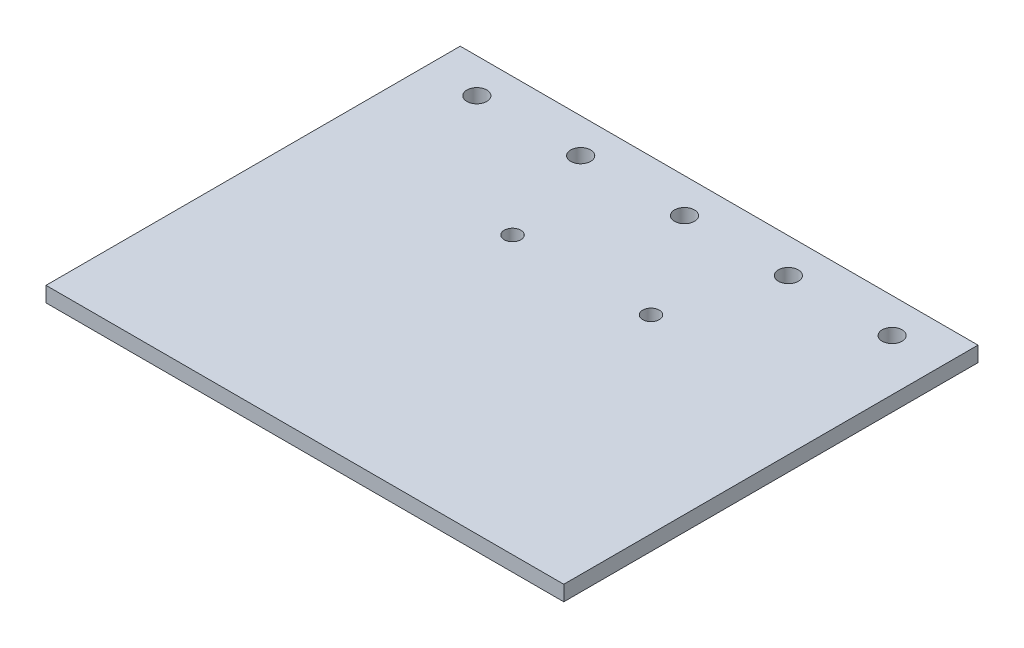
ISO-10303-21;
HEADER;
FILE_DESCRIPTION(('STEP AP214'),'2;1');
FILE_NAME('part.step','',(''),(''),'','','');
FILE_SCHEMA(('AUTOMOTIVE_DESIGN { 1 0 10303 214 1 1 1 1 }'));
ENDSEC;
DATA;
#1=APPLICATION_CONTEXT('core data for automotive mechanical design processes');
#2=APPLICATION_PROTOCOL_DEFINITION('international standard','automotive_design',2000,#1);
#3=PRODUCT_CONTEXT('',#1,'mechanical');
#4=PRODUCT('Part','Part','',(#3));
#5=PRODUCT_RELATED_PRODUCT_CATEGORY('part','',(#4));
#6=PRODUCT_DEFINITION_FORMATION('','',#4);
#7=PRODUCT_DEFINITION_CONTEXT('part definition',#1,'design');
#8=PRODUCT_DEFINITION('design','',#6,#7);
#9=PRODUCT_DEFINITION_SHAPE('','',#8);
#10=(LENGTH_UNIT() NAMED_UNIT(*) SI_UNIT(.MILLI.,.METRE.));
#11=(NAMED_UNIT(*) PLANE_ANGLE_UNIT() SI_UNIT($,.RADIAN.));
#12=(NAMED_UNIT(*) SI_UNIT($,.STERADIAN.) SOLID_ANGLE_UNIT());
#13=UNCERTAINTY_MEASURE_WITH_UNIT(LENGTH_MEASURE(1.E-05),#10,'distance_accuracy_value','');
#14=(GEOMETRIC_REPRESENTATION_CONTEXT(3) GLOBAL_UNCERTAINTY_ASSIGNED_CONTEXT((#13)) GLOBAL_UNIT_ASSIGNED_CONTEXT((#10,
#11,#12)) REPRESENTATION_CONTEXT('',''));
#15=CARTESIAN_POINT('',(0.,0.,0.));
#16=DIRECTION('',(0.,0.,1.));
#17=DIRECTION('',(1.,0.,0.));
#18=AXIS2_PLACEMENT_3D('',#15,#16,#17);
#19=CARTESIAN_POINT('',(47.5,2.794,-38.));
#20=DIRECTION('',(-1.,0.,0.));
#21=DIRECTION('',(0.,0.,1.));
#22=AXIS2_PLACEMENT_3D('',#19,#20,#21);
#23=PLANE('',#22);
#24=DIRECTION('',(0.,0.,-1.));
#25=VECTOR('',#24,1.);
#26=CARTESIAN_POINT('',(47.5,0.,-38.));
#27=LINE('',#26,#25);
#28=CARTESIAN_POINT('',(47.5,0.,38.));
#29=VERTEX_POINT('',#28);
#30=CARTESIAN_POINT('',(47.5,0.,-38.));
#31=VERTEX_POINT('',#30);
#32=EDGE_CURVE('E107',#29,#31,#27,.T.);
#33=ORIENTED_EDGE('',*,*,#32,.T.);
#34=DIRECTION('',(0.,-1.,0.));
#35=VECTOR('',#34,1.);
#36=CARTESIAN_POINT('',(47.5,2.794,-38.));
#37=LINE('',#36,#35);
#38=CARTESIAN_POINT('',(47.5,2.794,-38.));
#39=VERTEX_POINT('',#38);
#40=EDGE_CURVE('E11',#39,#31,#37,.T.);
#41=ORIENTED_EDGE('',*,*,#40,.F.);
#42=DIRECTION('',(0.,0.,-1.));
#43=VECTOR('',#42,1.);
#44=CARTESIAN_POINT('',(47.5,2.794,-38.));
#45=LINE('',#44,#43);
#46=CARTESIAN_POINT('',(47.5,2.794,38.));
#47=VERTEX_POINT('',#46);
#48=EDGE_CURVE('E91',#47,#39,#45,.T.);
#49=ORIENTED_EDGE('',*,*,#48,.F.);
#50=DIRECTION('',(0.,-1.,0.));
#51=VECTOR('',#50,1.);
#52=CARTESIAN_POINT('',(47.5,2.794,38.));
#53=LINE('',#52,#51);
#54=EDGE_CURVE('E103',#47,#29,#53,.T.);
#55=ORIENTED_EDGE('',*,*,#54,.T.);
#56=EDGE_LOOP('',(#33,#41,#49,#55));
#57=FACE_BOUND('',#56,.T.);
#58=ADVANCED_FACE('F39',(#57),#23,.F.);
#59=CARTESIAN_POINT('',(-47.5,2.794,-38.));
#60=DIRECTION('',(0.,0.,1.));
#61=DIRECTION('',(1.,0.,0.));
#62=AXIS2_PLACEMENT_3D('',#59,#60,#61);
#63=PLANE('',#62);
#64=DIRECTION('',(-1.,0.,0.));
#65=VECTOR('',#64,1.);
#66=CARTESIAN_POINT('',(-47.5,0.,-38.));
#67=LINE('',#66,#65);
#68=CARTESIAN_POINT('',(-47.5,0.,-38.));
#69=VERTEX_POINT('',#68);
#70=EDGE_CURVE('E96',#31,#69,#67,.T.);
#71=ORIENTED_EDGE('',*,*,#70,.T.);
#72=DIRECTION('',(0.,-1.,0.));
#73=VECTOR('',#72,1.);
#74=CARTESIAN_POINT('',(-47.5,2.794,-38.));
#75=LINE('',#74,#73);
#76=CARTESIAN_POINT('',(-47.5,2.794,-38.));
#77=VERTEX_POINT('',#76);
#78=EDGE_CURVE('E48',#77,#69,#75,.T.);
#79=ORIENTED_EDGE('',*,*,#78,.F.);
#80=DIRECTION('',(-1.,0.,0.));
#81=VECTOR('',#80,1.);
#82=CARTESIAN_POINT('',(-47.5,2.794,-38.));
#83=LINE('',#82,#81);
#84=EDGE_CURVE('E86',#39,#77,#83,.T.);
#85=ORIENTED_EDGE('',*,*,#84,.F.);
#86=ORIENTED_EDGE('',*,*,#40,.T.);
#87=EDGE_LOOP('',(#71,#79,#85,#86));
#88=FACE_BOUND('',#87,.T.);
#89=ADVANCED_FACE('F95',(#88),#63,.F.);
#90=CARTESIAN_POINT('',(-47.5,2.794,-38.));
#91=DIRECTION('',(1.,0.,0.));
#92=DIRECTION('',(0.,0.,-1.));
#93=AXIS2_PLACEMENT_3D('',#90,#91,#92);
#94=PLANE('',#93);
#95=DIRECTION('',(0.,0.,1.));
#96=VECTOR('',#95,1.);
#97=CARTESIAN_POINT('',(-47.5,0.,-38.));
#98=LINE('',#97,#96);
#99=CARTESIAN_POINT('',(-47.5,0.,38.));
#100=VERTEX_POINT('',#99);
#101=EDGE_CURVE('E73',#69,#100,#98,.T.);
#102=ORIENTED_EDGE('',*,*,#101,.T.);
#103=DIRECTION('',(0.,-1.,0.));
#104=VECTOR('',#103,1.);
#105=CARTESIAN_POINT('',(-47.5,2.794,38.));
#106=LINE('',#105,#104);
#107=CARTESIAN_POINT('',(-47.5,2.794,38.));
#108=VERTEX_POINT('',#107);
#109=EDGE_CURVE('E98',#108,#100,#106,.T.);
#110=ORIENTED_EDGE('',*,*,#109,.F.);
#111=DIRECTION('',(0.,0.,1.));
#112=VECTOR('',#111,1.);
#113=CARTESIAN_POINT('',(-47.5,2.794,-38.));
#114=LINE('',#113,#112);
#115=EDGE_CURVE('E89',#77,#108,#114,.T.);
#116=ORIENTED_EDGE('',*,*,#115,.F.);
#117=ORIENTED_EDGE('',*,*,#78,.T.);
#118=EDGE_LOOP('',(#102,#110,#116,#117));
#119=FACE_BOUND('',#118,.T.);
#120=ADVANCED_FACE('F99',(#119),#94,.F.);
#121=CARTESIAN_POINT('',(-47.5,2.794,38.));
#122=DIRECTION('',(0.,0.,-1.));
#123=DIRECTION('',(-1.,0.,0.));
#124=AXIS2_PLACEMENT_3D('',#121,#122,#123);
#125=PLANE('',#124);
#126=DIRECTION('',(1.,0.,0.));
#127=VECTOR('',#126,1.);
#128=CARTESIAN_POINT('',(-47.5,0.,38.));
#129=LINE('',#128,#127);
#130=EDGE_CURVE('E79',#100,#29,#129,.T.);
#131=ORIENTED_EDGE('',*,*,#130,.T.);
#132=ORIENTED_EDGE('',*,*,#54,.F.);
#133=DIRECTION('',(1.,0.,0.));
#134=VECTOR('',#133,1.);
#135=CARTESIAN_POINT('',(-47.5,2.794,38.));
#136=LINE('',#135,#134);
#137=EDGE_CURVE('E56',#108,#47,#136,.T.);
#138=ORIENTED_EDGE('',*,*,#137,.F.);
#139=ORIENTED_EDGE('',*,*,#109,.T.);
#140=EDGE_LOOP('',(#131,#132,#138,#139));
#141=FACE_BOUND('',#140,.T.);
#142=ADVANCED_FACE('F121',(#141),#125,.F.);
#143=CARTESIAN_POINT('',(0.,2.794,0.));
#144=DIRECTION('',(0.,1.,0.));
#145=DIRECTION('',(0.,0.,1.));
#146=AXIS2_PLACEMENT_3D('',#143,#144,#145);
#147=PLANE('',#146);
#148=CARTESIAN_POINT('',(-12.7,2.794,-12.8));
#149=DIRECTION('',(0.,1.,0.));
#150=DIRECTION('',(0.,0.,1.));
#151=AXIS2_PLACEMENT_3D('',#148,#149,#150);
#152=CIRCLE('',#151,1.524);
#153=CARTESIAN_POINT('',(-12.7,2.794,-11.276));
#154=VERTEX_POINT('',#153);
#155=EDGE_CURVE('E176',#154,#154,#152,.T.);
#156=ORIENTED_EDGE('',*,*,#155,.F.);
#157=EDGE_LOOP('',(#156));
#158=FACE_BOUND('',#157,.T.);
#159=CARTESIAN_POINT('',(12.7,2.794,-12.8));
#160=DIRECTION('',(0.,1.,0.));
#161=DIRECTION('',(0.,0.,1.));
#162=AXIS2_PLACEMENT_3D('',#159,#160,#161);
#163=CIRCLE('',#162,1.524);
#164=CARTESIAN_POINT('',(12.7,2.794,-11.276));
#165=VERTEX_POINT('',#164);
#166=EDGE_CURVE('E168',#165,#165,#163,.T.);
#167=ORIENTED_EDGE('',*,*,#166,.F.);
#168=EDGE_LOOP('',(#167));
#169=FACE_BOUND('',#168,.T.);
#170=CARTESIAN_POINT('',(-38.1,2.794,-31.65));
#171=DIRECTION('',(0.,1.,0.));
#172=DIRECTION('',(0.,0.,1.));
#173=AXIS2_PLACEMENT_3D('',#170,#171,#172);
#174=CIRCLE('',#173,1.8288);
#175=CARTESIAN_POINT('',(-38.1,2.794,-29.8212));
#176=VERTEX_POINT('',#175);
#177=EDGE_CURVE('E161',#176,#176,#174,.T.);
#178=ORIENTED_EDGE('',*,*,#177,.F.);
#179=EDGE_LOOP('',(#178));
#180=FACE_BOUND('',#179,.T.);
#181=CARTESIAN_POINT('',(-19.05,2.794,-31.65));
#182=DIRECTION('',(0.,1.,0.));
#183=DIRECTION('',(0.,0.,1.));
#184=AXIS2_PLACEMENT_3D('',#181,#182,#183);
#185=CIRCLE('',#184,1.8288);
#186=CARTESIAN_POINT('',(-19.05,2.794,-29.8212));
#187=VERTEX_POINT('',#186);
#188=EDGE_CURVE('E153',#187,#187,#185,.T.);
#189=ORIENTED_EDGE('',*,*,#188,.F.);
#190=EDGE_LOOP('',(#189));
#191=FACE_BOUND('',#190,.T.);
#192=CARTESIAN_POINT('',(0.,2.794,-31.65));
#193=DIRECTION('',(0.,1.,0.));
#194=DIRECTION('',(0.,0.,1.));
#195=AXIS2_PLACEMENT_3D('',#192,#193,#194);
#196=CIRCLE('',#195,1.8288);
#197=CARTESIAN_POINT('',(0.,2.794,-29.8212));
#198=VERTEX_POINT('',#197);
#199=EDGE_CURVE('E145',#198,#198,#196,.T.);
#200=ORIENTED_EDGE('',*,*,#199,.F.);
#201=EDGE_LOOP('',(#200));
#202=FACE_BOUND('',#201,.T.);
#203=CARTESIAN_POINT('',(19.05,2.794,-31.65));
#204=DIRECTION('',(0.,1.,0.));
#205=DIRECTION('',(0.,0.,1.));
#206=AXIS2_PLACEMENT_3D('',#203,#204,#205);
#207=CIRCLE('',#206,1.8288);
#208=CARTESIAN_POINT('',(19.05,2.794,-29.8212));
#209=VERTEX_POINT('',#208);
#210=EDGE_CURVE('E137',#209,#209,#207,.T.);
#211=ORIENTED_EDGE('',*,*,#210,.F.);
#212=EDGE_LOOP('',(#211));
#213=FACE_BOUND('',#212,.T.);
#214=CARTESIAN_POINT('',(38.1,2.794,-31.65));
#215=DIRECTION('',(0.,1.,0.));
#216=DIRECTION('',(0.,0.,1.));
#217=AXIS2_PLACEMENT_3D('',#214,#215,#216);
#218=CIRCLE('',#217,1.8288);
#219=CARTESIAN_POINT('',(38.1,2.794,-29.8212));
#220=VERTEX_POINT('',#219);
#221=EDGE_CURVE('E128',#220,#220,#218,.T.);
#222=ORIENTED_EDGE('',*,*,#221,.F.);
#223=EDGE_LOOP('',(#222));
#224=FACE_BOUND('',#223,.T.);
#225=ORIENTED_EDGE('',*,*,#48,.T.);
#226=ORIENTED_EDGE('',*,*,#84,.T.);
#227=ORIENTED_EDGE('',*,*,#115,.T.);
#228=ORIENTED_EDGE('',*,*,#137,.T.);
#229=EDGE_LOOP('',(#225,#226,#227,#228));
#230=FACE_BOUND('',#229,.T.);
#231=ADVANCED_FACE('F87',(#158,#169,#180,#191,#202,#213,#224,#230),#147,.T.);
#232=CARTESIAN_POINT('',(0.,0.,0.));
#233=DIRECTION('',(0.,1.,0.));
#234=DIRECTION('',(0.,0.,1.));
#235=AXIS2_PLACEMENT_3D('',#232,#233,#234);
#236=PLANE('',#235);
#237=CARTESIAN_POINT('',(-12.7,0.,-12.8));
#238=DIRECTION('',(0.,1.,0.));
#239=DIRECTION('',(0.,0.,1.));
#240=AXIS2_PLACEMENT_3D('',#237,#238,#239);
#241=CIRCLE('',#240,1.524);
#242=CARTESIAN_POINT('',(-12.7,0.,-11.276));
#243=VERTEX_POINT('',#242);
#244=EDGE_CURVE('E133',#243,#243,#241,.T.);
#245=ORIENTED_EDGE('',*,*,#244,.T.);
#246=EDGE_LOOP('',(#245));
#247=FACE_BOUND('',#246,.T.);
#248=CARTESIAN_POINT('',(12.7,0.,-12.8));
#249=DIRECTION('',(0.,1.,0.));
#250=DIRECTION('',(0.,0.,1.));
#251=AXIS2_PLACEMENT_3D('',#248,#249,#250);
#252=CIRCLE('',#251,1.524);
#253=CARTESIAN_POINT('',(12.7,0.,-11.276));
#254=VERTEX_POINT('',#253);
#255=EDGE_CURVE('E172',#254,#254,#252,.T.);
#256=ORIENTED_EDGE('',*,*,#255,.T.);
#257=EDGE_LOOP('',(#256));
#258=FACE_BOUND('',#257,.T.);
#259=CARTESIAN_POINT('',(-38.1,0.,-31.65));
#260=DIRECTION('',(0.,1.,0.));
#261=DIRECTION('',(0.,0.,1.));
#262=AXIS2_PLACEMENT_3D('',#259,#260,#261);
#263=CIRCLE('',#262,1.8288);
#264=CARTESIAN_POINT('',(-38.1,0.,-29.8212));
#265=VERTEX_POINT('',#264);
#266=EDGE_CURVE('E111',#265,#265,#263,.T.);
#267=ORIENTED_EDGE('',*,*,#266,.T.);
#268=EDGE_LOOP('',(#267));
#269=FACE_BOUND('',#268,.T.);
#270=CARTESIAN_POINT('',(-19.05,0.,-31.65));
#271=DIRECTION('',(0.,1.,0.));
#272=DIRECTION('',(0.,0.,1.));
#273=AXIS2_PLACEMENT_3D('',#270,#271,#272);
#274=CIRCLE('',#273,1.8288);
#275=CARTESIAN_POINT('',(-19.05,0.,-29.8212));
#276=VERTEX_POINT('',#275);
#277=EDGE_CURVE('E157',#276,#276,#274,.T.);
#278=ORIENTED_EDGE('',*,*,#277,.T.);
#279=EDGE_LOOP('',(#278));
#280=FACE_BOUND('',#279,.T.);
#281=CARTESIAN_POINT('',(0.,0.,-31.65));
#282=DIRECTION('',(0.,1.,0.));
#283=DIRECTION('',(0.,0.,1.));
#284=AXIS2_PLACEMENT_3D('',#281,#282,#283);
#285=CIRCLE('',#284,1.8288);
#286=CARTESIAN_POINT('',(0.,0.,-29.8212));
#287=VERTEX_POINT('',#286);
#288=EDGE_CURVE('E149',#287,#287,#285,.T.);
#289=ORIENTED_EDGE('',*,*,#288,.T.);
#290=EDGE_LOOP('',(#289));
#291=FACE_BOUND('',#290,.T.);
#292=CARTESIAN_POINT('',(19.05,0.,-31.65));
#293=DIRECTION('',(0.,1.,0.));
#294=DIRECTION('',(0.,0.,1.));
#295=AXIS2_PLACEMENT_3D('',#292,#293,#294);
#296=CIRCLE('',#295,1.8288);
#297=CARTESIAN_POINT('',(19.05,0.,-29.8212));
#298=VERTEX_POINT('',#297);
#299=EDGE_CURVE('E141',#298,#298,#296,.T.);
#300=ORIENTED_EDGE('',*,*,#299,.T.);
#301=EDGE_LOOP('',(#300));
#302=FACE_BOUND('',#301,.T.);
#303=CARTESIAN_POINT('',(38.1,0.,-31.65));
#304=DIRECTION('',(0.,1.,0.));
#305=DIRECTION('',(0.,0.,1.));
#306=AXIS2_PLACEMENT_3D('',#303,#304,#305);
#307=CIRCLE('',#306,1.8288);
#308=CARTESIAN_POINT('',(38.1,0.,-29.8212));
#309=VERTEX_POINT('',#308);
#310=EDGE_CURVE('E132',#309,#309,#307,.T.);
#311=ORIENTED_EDGE('',*,*,#310,.T.);
#312=EDGE_LOOP('',(#311));
#313=FACE_BOUND('',#312,.T.);
#314=ORIENTED_EDGE('',*,*,#32,.F.);
#315=ORIENTED_EDGE('',*,*,#130,.F.);
#316=ORIENTED_EDGE('',*,*,#101,.F.);
#317=ORIENTED_EDGE('',*,*,#70,.F.);
#318=EDGE_LOOP('',(#314,#315,#316,#317));
#319=FACE_BOUND('',#318,.T.);
#320=ADVANCED_FACE('F124',(#247,#258,#269,#280,#291,#302,#313,#319),#236,.F.);
#321=CARTESIAN_POINT('',(38.1,0.,-31.65));
#322=DIRECTION('',(0.,1.,0.));
#323=DIRECTION('',(0.,0.,1.));
#324=AXIS2_PLACEMENT_3D('',#321,#322,#323);
#325=CYLINDRICAL_SURFACE('',#324,1.8288);
#326=ORIENTED_EDGE('',*,*,#310,.F.);
#327=EDGE_LOOP('',(#326));
#328=FACE_BOUND('',#327,.T.);
#329=ORIENTED_EDGE('',*,*,#221,.T.);
#330=EDGE_LOOP('',(#329));
#331=FACE_BOUND('',#330,.T.);
#332=ADVANCED_FACE('F208',(#328,#331),#325,.F.);
#333=CARTESIAN_POINT('',(19.05,0.,-31.65));
#334=DIRECTION('',(0.,1.,0.));
#335=DIRECTION('',(0.,0.,1.));
#336=AXIS2_PLACEMENT_3D('',#333,#334,#335);
#337=CYLINDRICAL_SURFACE('',#336,1.8288);
#338=ORIENTED_EDGE('',*,*,#299,.F.);
#339=EDGE_LOOP('',(#338));
#340=FACE_BOUND('',#339,.T.);
#341=ORIENTED_EDGE('',*,*,#210,.T.);
#342=EDGE_LOOP('',(#341));
#343=FACE_BOUND('',#342,.T.);
#344=ADVANCED_FACE('F210',(#340,#343),#337,.F.);
#345=CARTESIAN_POINT('',(0.,0.,-31.65));
#346=DIRECTION('',(0.,1.,0.));
#347=DIRECTION('',(0.,0.,1.));
#348=AXIS2_PLACEMENT_3D('',#345,#346,#347);
#349=CYLINDRICAL_SURFACE('',#348,1.8288);
#350=ORIENTED_EDGE('',*,*,#288,.F.);
#351=EDGE_LOOP('',(#350));
#352=FACE_BOUND('',#351,.T.);
#353=ORIENTED_EDGE('',*,*,#199,.T.);
#354=EDGE_LOOP('',(#353));
#355=FACE_BOUND('',#354,.T.);
#356=ADVANCED_FACE('F217',(#352,#355),#349,.F.);
#357=CARTESIAN_POINT('',(-19.05,0.,-31.65));
#358=DIRECTION('',(0.,1.,0.));
#359=DIRECTION('',(0.,0.,1.));
#360=AXIS2_PLACEMENT_3D('',#357,#358,#359);
#361=CYLINDRICAL_SURFACE('',#360,1.8288);
#362=ORIENTED_EDGE('',*,*,#277,.F.);
#363=EDGE_LOOP('',(#362));
#364=FACE_BOUND('',#363,.T.);
#365=ORIENTED_EDGE('',*,*,#188,.T.);
#366=EDGE_LOOP('',(#365));
#367=FACE_BOUND('',#366,.T.);
#368=ADVANCED_FACE('F270',(#364,#367),#361,.F.);
#369=CARTESIAN_POINT('',(-38.1,0.,-31.65));
#370=DIRECTION('',(0.,1.,0.));
#371=DIRECTION('',(0.,0.,1.));
#372=AXIS2_PLACEMENT_3D('',#369,#370,#371);
#373=CYLINDRICAL_SURFACE('',#372,1.8288);
#374=ORIENTED_EDGE('',*,*,#266,.F.);
#375=EDGE_LOOP('',(#374));
#376=FACE_BOUND('',#375,.T.);
#377=ORIENTED_EDGE('',*,*,#177,.T.);
#378=EDGE_LOOP('',(#377));
#379=FACE_BOUND('',#378,.T.);
#380=ADVANCED_FACE('F255',(#376,#379),#373,.F.);
#381=CARTESIAN_POINT('',(12.7,0.,-12.8));
#382=DIRECTION('',(0.,1.,0.));
#383=DIRECTION('',(0.,0.,1.));
#384=AXIS2_PLACEMENT_3D('',#381,#382,#383);
#385=CYLINDRICAL_SURFACE('',#384,1.524);
#386=ORIENTED_EDGE('',*,*,#255,.F.);
#387=EDGE_LOOP('',(#386));
#388=FACE_BOUND('',#387,.T.);
#389=ORIENTED_EDGE('',*,*,#166,.T.);
#390=EDGE_LOOP('',(#389));
#391=FACE_BOUND('',#390,.T.);
#392=ADVANCED_FACE('F189',(#388,#391),#385,.F.);
#393=CARTESIAN_POINT('',(-12.7,0.,-12.8));
#394=DIRECTION('',(0.,1.,0.));
#395=DIRECTION('',(0.,0.,1.));
#396=AXIS2_PLACEMENT_3D('',#393,#394,#395);
#397=CYLINDRICAL_SURFACE('',#396,1.524);
#398=ORIENTED_EDGE('',*,*,#244,.F.);
#399=EDGE_LOOP('',(#398));
#400=FACE_BOUND('',#399,.T.);
#401=ORIENTED_EDGE('',*,*,#155,.T.);
#402=EDGE_LOOP('',(#401));
#403=FACE_BOUND('',#402,.T.);
#404=ADVANCED_FACE('F186',(#400,#403),#397,.F.);
#405=CLOSED_SHELL('',(#58,#89,#120,#142,#231,#320,#332,#344,#356,#368,#380,#392,#404));
#406=MANIFOLD_SOLID_BREP('B2',#405);
#407=ADVANCED_BREP_SHAPE_REPRESENTATION('',(#18,#406),#14);
#408=SHAPE_DEFINITION_REPRESENTATION(#9,#407);
ENDSEC;
END-ISO-10303-21;
